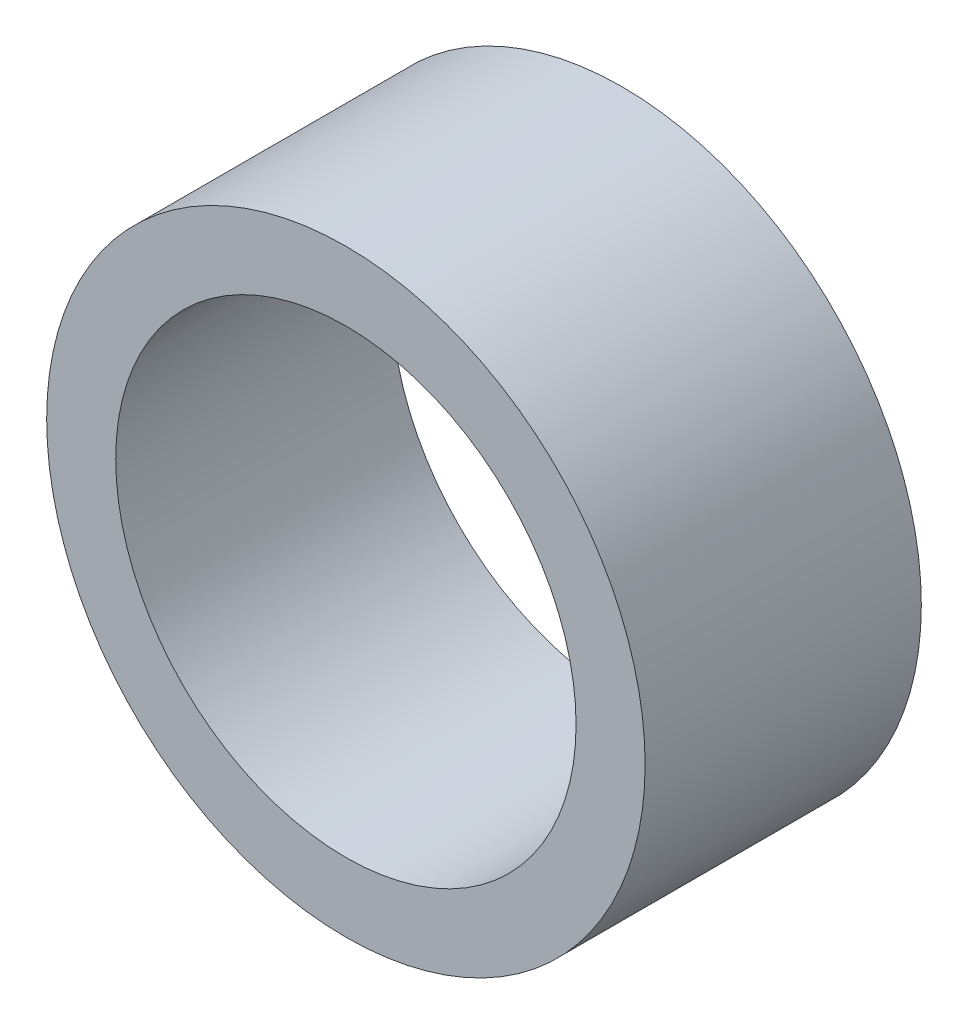
ISO-10303-21;
HEADER;
FILE_DESCRIPTION(('STEP AP214'),'2;1');
FILE_NAME('part.step','',(''),(''),'','','');
FILE_SCHEMA(('AUTOMOTIVE_DESIGN { 1 0 10303 214 1 1 1 1 }'));
ENDSEC;
DATA;
#1=APPLICATION_CONTEXT('core data for automotive mechanical design processes');
#2=APPLICATION_PROTOCOL_DEFINITION('international standard','automotive_design',2000,#1);
#3=PRODUCT_CONTEXT('',#1,'mechanical');
#4=PRODUCT('Part','Part','',(#3));
#5=PRODUCT_RELATED_PRODUCT_CATEGORY('part','',(#4));
#6=PRODUCT_DEFINITION_FORMATION('','',#4);
#7=PRODUCT_DEFINITION_CONTEXT('part definition',#1,'design');
#8=PRODUCT_DEFINITION('design','',#6,#7);
#9=PRODUCT_DEFINITION_SHAPE('','',#8);
#10=(LENGTH_UNIT() NAMED_UNIT(*) SI_UNIT(.MILLI.,.METRE.));
#11=(NAMED_UNIT(*) PLANE_ANGLE_UNIT() SI_UNIT($,.RADIAN.));
#12=(NAMED_UNIT(*) SI_UNIT($,.STERADIAN.) SOLID_ANGLE_UNIT());
#13=UNCERTAINTY_MEASURE_WITH_UNIT(LENGTH_MEASURE(1.E-05),#10,'distance_accuracy_value','');
#14=(GEOMETRIC_REPRESENTATION_CONTEXT(3) GLOBAL_UNCERTAINTY_ASSIGNED_CONTEXT((#13)) GLOBAL_UNIT_ASSIGNED_CONTEXT((#10,
#11,#12)) REPRESENTATION_CONTEXT('',''));
#15=CARTESIAN_POINT('',(0.,0.,0.));
#16=DIRECTION('',(0.,0.,1.));
#17=DIRECTION('',(1.,0.,0.));
#18=AXIS2_PLACEMENT_3D('',#15,#16,#17);
#19=CARTESIAN_POINT('',(0.,0.,6.));
#20=DIRECTION('',(0.,0.,1.));
#21=DIRECTION('',(1.,0.,0.));
#22=AXIS2_PLACEMENT_3D('',#19,#20,#21);
#23=PLANE('',#22);
#24=CARTESIAN_POINT('',(0.,0.,6.));
#25=DIRECTION('',(0.,0.,1.));
#26=DIRECTION('',(1.,0.,0.));
#27=AXIS2_PLACEMENT_3D('',#24,#25,#26);
#28=CIRCLE('',#27,6.5);
#29=CARTESIAN_POINT('',(6.5,0.,6.));
#30=VERTEX_POINT('',#29);
#31=EDGE_CURVE('E10',#30,#30,#28,.T.);
#32=ORIENTED_EDGE('',*,*,#31,.T.);
#33=EDGE_LOOP('',(#32));
#34=FACE_BOUND('',#33,.T.);
#35=CARTESIAN_POINT('',(0.,0.,6.));
#36=DIRECTION('',(0.,0.,1.));
#37=DIRECTION('',(1.,0.,0.));
#38=AXIS2_PLACEMENT_3D('',#35,#36,#37);
#39=CIRCLE('',#38,5.);
#40=CARTESIAN_POINT('',(5.,0.,6.));
#41=VERTEX_POINT('',#40);
#42=EDGE_CURVE('E41',#41,#41,#39,.T.);
#43=ORIENTED_EDGE('',*,*,#42,.F.);
#44=EDGE_LOOP('',(#43));
#45=FACE_BOUND('',#44,.T.);
#46=ADVANCED_FACE('F30',(#34,#45),#23,.T.);
#47=CARTESIAN_POINT('',(0.,0.,0.));
#48=DIRECTION('',(0.,0.,1.));
#49=DIRECTION('',(1.,0.,0.));
#50=AXIS2_PLACEMENT_3D('',#47,#48,#49);
#51=PLANE('',#50);
#52=CARTESIAN_POINT('',(0.,0.,0.));
#53=DIRECTION('',(0.,0.,1.));
#54=DIRECTION('',(1.,0.,0.));
#55=AXIS2_PLACEMENT_3D('',#52,#53,#54);
#56=CIRCLE('',#55,6.5);
#57=CARTESIAN_POINT('',(6.5,0.,0.));
#58=VERTEX_POINT('',#57);
#59=EDGE_CURVE('E34',#58,#58,#56,.T.);
#60=ORIENTED_EDGE('',*,*,#59,.F.);
#61=EDGE_LOOP('',(#60));
#62=FACE_BOUND('',#61,.T.);
#63=CARTESIAN_POINT('',(0.,0.,0.));
#64=DIRECTION('',(0.,0.,1.));
#65=DIRECTION('',(1.,0.,0.));
#66=AXIS2_PLACEMENT_3D('',#63,#64,#65);
#67=CIRCLE('',#66,5.);
#68=CARTESIAN_POINT('',(5.,0.,0.));
#69=VERTEX_POINT('',#68);
#70=EDGE_CURVE('E43',#69,#69,#67,.T.);
#71=ORIENTED_EDGE('',*,*,#70,.T.);
#72=EDGE_LOOP('',(#71));
#73=FACE_BOUND('',#72,.T.);
#74=ADVANCED_FACE('F53',(#62,#73),#51,.F.);
#75=CARTESIAN_POINT('',(0.,0.,6.));
#76=DIRECTION('',(0.,0.,-1.));
#77=DIRECTION('',(-1.,0.,0.));
#78=AXIS2_PLACEMENT_3D('',#75,#76,#77);
#79=CYLINDRICAL_SURFACE('',#78,6.5);
#80=ORIENTED_EDGE('',*,*,#31,.F.);
#81=EDGE_LOOP('',(#80));
#82=FACE_BOUND('',#81,.T.);
#83=ORIENTED_EDGE('',*,*,#59,.T.);
#84=EDGE_LOOP('',(#83));
#85=FACE_BOUND('',#84,.T.);
#86=ADVANCED_FACE('F32',(#82,#85),#79,.T.);
#87=CARTESIAN_POINT('',(0.,0.,6.));
#88=DIRECTION('',(0.,0.,-1.));
#89=DIRECTION('',(-1.,0.,0.));
#90=AXIS2_PLACEMENT_3D('',#87,#88,#89);
#91=CYLINDRICAL_SURFACE('',#90,5.);
#92=ORIENTED_EDGE('',*,*,#42,.T.);
#93=EDGE_LOOP('',(#92));
#94=FACE_BOUND('',#93,.T.);
#95=ORIENTED_EDGE('',*,*,#70,.F.);
#96=EDGE_LOOP('',(#95));
#97=FACE_BOUND('',#96,.T.);
#98=ADVANCED_FACE('F49',(#94,#97),#91,.F.);
#99=CLOSED_SHELL('',(#46,#74,#86,#98));
#100=MANIFOLD_SOLID_BREP('B2',#99);
#101=ADVANCED_BREP_SHAPE_REPRESENTATION('',(#18,#100),#14);
#102=SHAPE_DEFINITION_REPRESENTATION(#9,#101);
ENDSEC;
END-ISO-10303-21;
